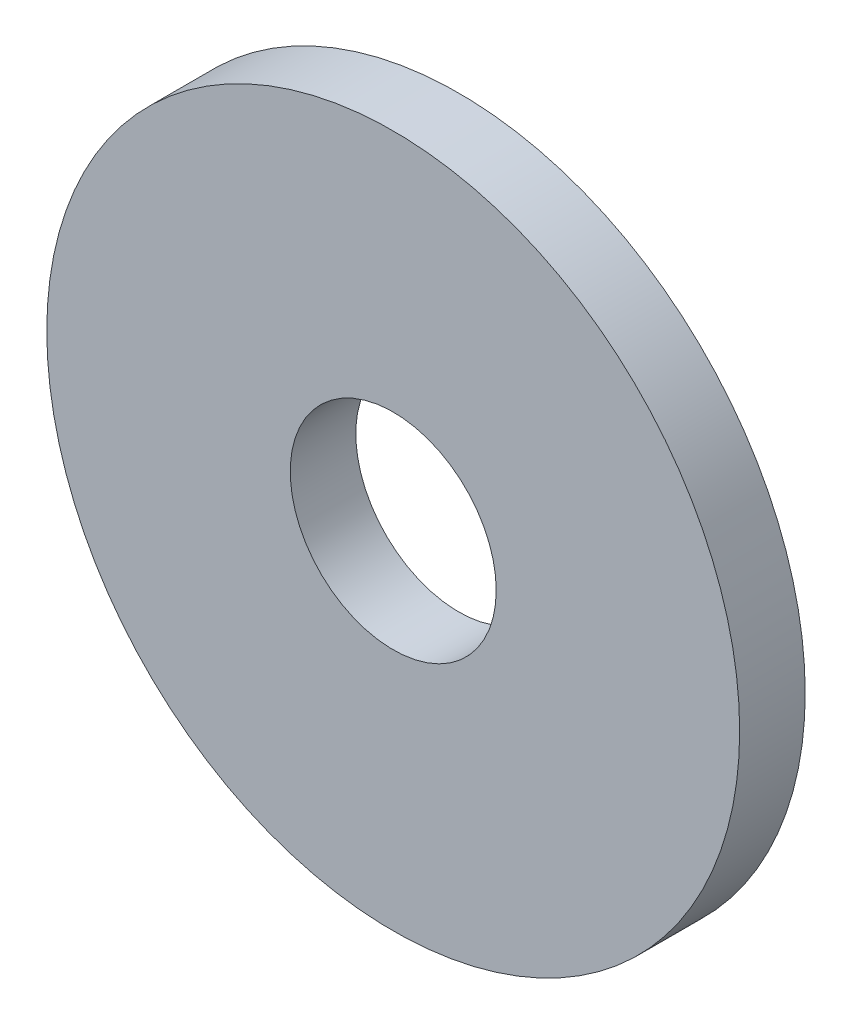
ISO-10303-21;
HEADER;
FILE_DESCRIPTION(('STEP AP214'),'2;1');
FILE_NAME('part.step','',(''),(''),'','','');
FILE_SCHEMA(('AUTOMOTIVE_DESIGN { 1 0 10303 214 1 1 1 1 }'));
ENDSEC;
DATA;
#1=APPLICATION_CONTEXT('core data for automotive mechanical design processes');
#2=APPLICATION_PROTOCOL_DEFINITION('international standard','automotive_design',2000,#1);
#3=PRODUCT_CONTEXT('',#1,'mechanical');
#4=PRODUCT('Part','Part','',(#3));
#5=PRODUCT_RELATED_PRODUCT_CATEGORY('part','',(#4));
#6=PRODUCT_DEFINITION_FORMATION('','',#4);
#7=PRODUCT_DEFINITION_CONTEXT('part definition',#1,'design');
#8=PRODUCT_DEFINITION('design','',#6,#7);
#9=PRODUCT_DEFINITION_SHAPE('','',#8);
#10=(LENGTH_UNIT() NAMED_UNIT(*) SI_UNIT(.MILLI.,.METRE.));
#11=(NAMED_UNIT(*) PLANE_ANGLE_UNIT() SI_UNIT($,.RADIAN.));
#12=(NAMED_UNIT(*) SI_UNIT($,.STERADIAN.) SOLID_ANGLE_UNIT());
#13=UNCERTAINTY_MEASURE_WITH_UNIT(LENGTH_MEASURE(1.E-05),#10,'distance_accuracy_value','');
#14=(GEOMETRIC_REPRESENTATION_CONTEXT(3) GLOBAL_UNCERTAINTY_ASSIGNED_CONTEXT((#13)) GLOBAL_UNIT_ASSIGNED_CONTEXT((#10,
#11,#12)) REPRESENTATION_CONTEXT('',''));
#15=CARTESIAN_POINT('',(0.,0.,0.));
#16=DIRECTION('',(0.,0.,1.));
#17=DIRECTION('',(1.,0.,0.));
#18=AXIS2_PLACEMENT_3D('',#15,#16,#17);
#19=CARTESIAN_POINT('',(0.,0.,7.));
#20=DIRECTION('',(0.,0.,1.));
#21=DIRECTION('',(1.,0.,0.));
#22=AXIS2_PLACEMENT_3D('',#19,#20,#21);
#23=PLANE('',#22);
#24=CARTESIAN_POINT('',(0.,0.,7.));
#25=DIRECTION('',(0.,0.,1.));
#26=DIRECTION('',(1.,0.,0.));
#27=AXIS2_PLACEMENT_3D('',#24,#25,#26);
#28=CIRCLE('',#27,37.);
#29=CARTESIAN_POINT('',(37.,0.,7.));
#30=VERTEX_POINT('',#29);
#31=EDGE_CURVE('E10',#30,#30,#28,.T.);
#32=ORIENTED_EDGE('',*,*,#31,.T.);
#33=EDGE_LOOP('',(#32));
#34=FACE_BOUND('',#33,.T.);
#35=CARTESIAN_POINT('',(0.,0.,7.));
#36=DIRECTION('',(0.,0.,1.));
#37=DIRECTION('',(1.,0.,0.));
#38=AXIS2_PLACEMENT_3D('',#35,#36,#37);
#39=CIRCLE('',#38,11.);
#40=CARTESIAN_POINT('',(11.,0.,7.));
#41=VERTEX_POINT('',#40);
#42=EDGE_CURVE('E50',#41,#41,#39,.T.);
#43=ORIENTED_EDGE('',*,*,#42,.F.);
#44=EDGE_LOOP('',(#43));
#45=FACE_BOUND('',#44,.T.);
#46=ADVANCED_FACE('F37',(#34,#45),#23,.T.);
#47=CARTESIAN_POINT('',(0.,0.,0.));
#48=DIRECTION('',(0.,0.,1.));
#49=DIRECTION('',(1.,0.,0.));
#50=AXIS2_PLACEMENT_3D('',#47,#48,#49);
#51=PLANE('',#50);
#52=CARTESIAN_POINT('',(0.,0.,0.));
#53=DIRECTION('',(0.,0.,1.));
#54=DIRECTION('',(1.,0.,0.));
#55=AXIS2_PLACEMENT_3D('',#52,#53,#54);
#56=CIRCLE('',#55,37.);
#57=CARTESIAN_POINT('',(37.,0.,0.));
#58=VERTEX_POINT('',#57);
#59=EDGE_CURVE('E41',#58,#58,#56,.T.);
#60=ORIENTED_EDGE('',*,*,#59,.F.);
#61=EDGE_LOOP('',(#60));
#62=FACE_BOUND('',#61,.T.);
#63=CARTESIAN_POINT('',(0.,0.,0.));
#64=DIRECTION('',(0.,0.,1.));
#65=DIRECTION('',(1.,0.,0.));
#66=AXIS2_PLACEMENT_3D('',#63,#64,#65);
#67=CIRCLE('',#66,11.);
#68=CARTESIAN_POINT('',(11.,0.,0.));
#69=VERTEX_POINT('',#68);
#70=EDGE_CURVE('E52',#69,#69,#67,.T.);
#71=ORIENTED_EDGE('',*,*,#70,.T.);
#72=EDGE_LOOP('',(#71));
#73=FACE_BOUND('',#72,.T.);
#74=ADVANCED_FACE('F64',(#62,#73),#51,.F.);
#75=CARTESIAN_POINT('',(0.,0.,7.));
#76=DIRECTION('',(0.,0.,-1.));
#77=DIRECTION('',(-1.,0.,0.));
#78=AXIS2_PLACEMENT_3D('',#75,#76,#77);
#79=CYLINDRICAL_SURFACE('',#78,37.);
#80=ORIENTED_EDGE('',*,*,#31,.F.);
#81=EDGE_LOOP('',(#80));
#82=FACE_BOUND('',#81,.T.);
#83=ORIENTED_EDGE('',*,*,#59,.T.);
#84=EDGE_LOOP('',(#83));
#85=FACE_BOUND('',#84,.T.);
#86=ADVANCED_FACE('F39',(#82,#85),#79,.T.);
#87=CARTESIAN_POINT('',(0.,0.,7.));
#88=DIRECTION('',(0.,0.,-1.));
#89=DIRECTION('',(-1.,0.,0.));
#90=AXIS2_PLACEMENT_3D('',#87,#88,#89);
#91=CYLINDRICAL_SURFACE('',#90,11.);
#92=ORIENTED_EDGE('',*,*,#42,.T.);
#93=EDGE_LOOP('',(#92));
#94=FACE_BOUND('',#93,.T.);
#95=ORIENTED_EDGE('',*,*,#70,.F.);
#96=EDGE_LOOP('',(#95));
#97=FACE_BOUND('',#96,.T.);
#98=ADVANCED_FACE('F60',(#94,#97),#91,.F.);
#99=CLOSED_SHELL('',(#46,#74,#86,#98));
#100=MANIFOLD_SOLID_BREP('B2',#99);
#101=ADVANCED_BREP_SHAPE_REPRESENTATION('',(#18,#100),#14);
#102=SHAPE_DEFINITION_REPRESENTATION(#9,#101);
ENDSEC;
END-ISO-10303-21;
